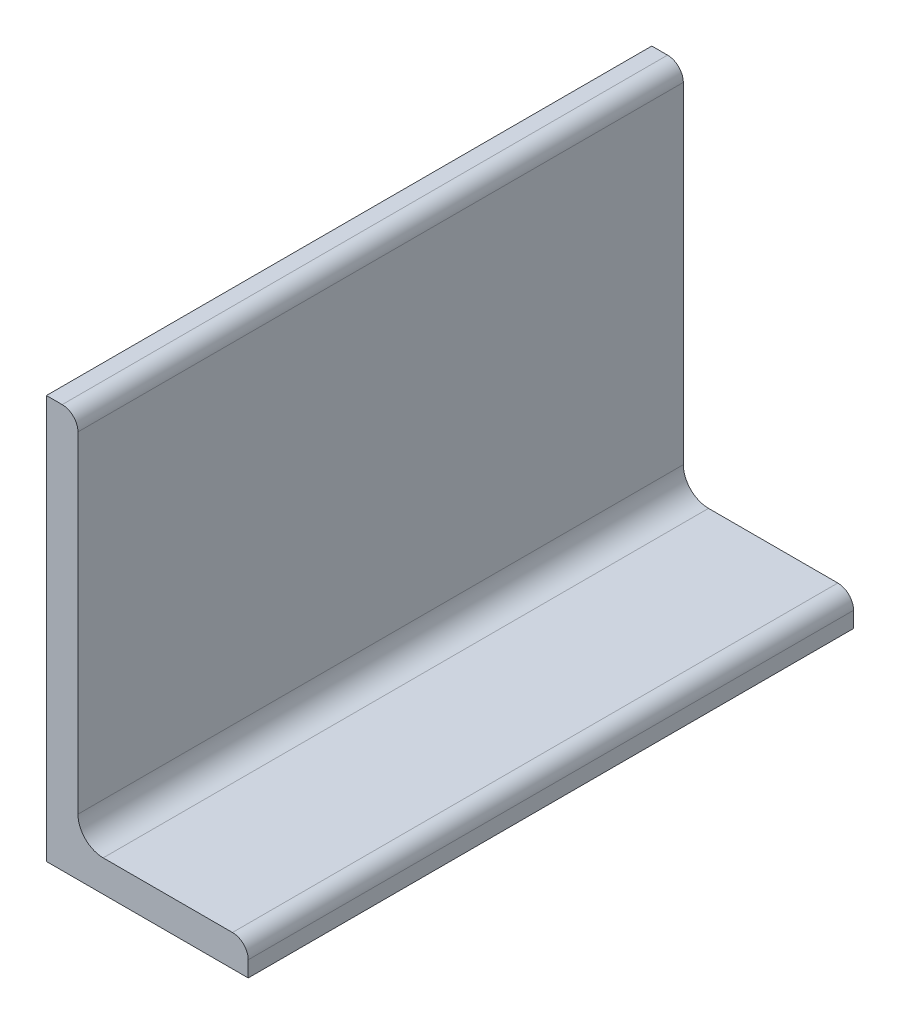
ISO-10303-21;
HEADER;
FILE_DESCRIPTION(('STEP AP214'),'2;1');
FILE_NAME('part.step','',(''),(''),'','','');
FILE_SCHEMA(('AUTOMOTIVE_DESIGN { 1 0 10303 214 1 1 1 1 }'));
ENDSEC;
DATA;
#1=APPLICATION_CONTEXT('core data for automotive mechanical design processes');
#2=APPLICATION_PROTOCOL_DEFINITION('international standard','automotive_design',2000,#1);
#3=PRODUCT_CONTEXT('',#1,'mechanical');
#4=PRODUCT('Part','Part','',(#3));
#5=PRODUCT_RELATED_PRODUCT_CATEGORY('part','',(#4));
#6=PRODUCT_DEFINITION_FORMATION('','',#4);
#7=PRODUCT_DEFINITION_CONTEXT('part definition',#1,'design');
#8=PRODUCT_DEFINITION('design','',#6,#7);
#9=PRODUCT_DEFINITION_SHAPE('','',#8);
#10=(LENGTH_UNIT() NAMED_UNIT(*) SI_UNIT(.MILLI.,.METRE.));
#11=(NAMED_UNIT(*) PLANE_ANGLE_UNIT() SI_UNIT($,.RADIAN.));
#12=(NAMED_UNIT(*) SI_UNIT($,.STERADIAN.) SOLID_ANGLE_UNIT());
#13=UNCERTAINTY_MEASURE_WITH_UNIT(LENGTH_MEASURE(1.E-05),#10,'distance_accuracy_value','');
#14=(GEOMETRIC_REPRESENTATION_CONTEXT(3) GLOBAL_UNCERTAINTY_ASSIGNED_CONTEXT((#13)) GLOBAL_UNIT_ASSIGNED_CONTEXT((#10,
#11,#12)) REPRESENTATION_CONTEXT('',''));
#15=CARTESIAN_POINT('',(0.,0.,0.));
#16=DIRECTION('',(0.,0.,1.));
#17=DIRECTION('',(1.,0.,0.));
#18=AXIS2_PLACEMENT_3D('',#15,#16,#17);
#19=CARTESIAN_POINT('',(0.865045893659089,203.678837479772,304.8));
#20=DIRECTION('',(1.,0.,0.));
#21=DIRECTION('',(0.,0.,-1.));
#22=AXIS2_PLACEMENT_3D('',#19,#20,#21);
#23=PLANE('',#22);
#24=DIRECTION('',(0.,-1.,0.));
#25=VECTOR('',#24,1.);
#26=CARTESIAN_POINT('',(0.865045893659089,203.678837479772,0.));
#27=LINE('',#26,#25);
#28=CARTESIAN_POINT('',(0.865045893659089,203.678837479772,0.));
#29=VERTEX_POINT('',#28);
#30=CARTESIAN_POINT('',(0.865045893659089,0.478837479771708,0.));
#31=VERTEX_POINT('',#30);
#32=EDGE_CURVE('E135',#29,#31,#27,.T.);
#33=ORIENTED_EDGE('',*,*,#32,.T.);
#34=DIRECTION('',(0.,0.,-1.));
#35=VECTOR('',#34,1.);
#36=CARTESIAN_POINT('',(0.865045893659089,0.478837479771708,304.8));
#37=LINE('',#36,#35);
#38=CARTESIAN_POINT('',(0.865045893659089,0.478837479771708,304.8));
#39=VERTEX_POINT('',#38);
#40=EDGE_CURVE('E11',#39,#31,#37,.T.);
#41=ORIENTED_EDGE('',*,*,#40,.F.);
#42=DIRECTION('',(0.,-1.,0.));
#43=VECTOR('',#42,1.);
#44=CARTESIAN_POINT('',(0.865045893659089,203.678837479772,304.8));
#45=LINE('',#44,#43);
#46=CARTESIAN_POINT('',(0.865045893659089,203.678837479772,304.8));
#47=VERTEX_POINT('',#46);
#48=EDGE_CURVE('E151',#47,#39,#45,.T.);
#49=ORIENTED_EDGE('',*,*,#48,.F.);
#50=DIRECTION('',(0.,0.,-1.));
#51=VECTOR('',#50,1.);
#52=CARTESIAN_POINT('',(0.865045893659089,203.678837479772,304.8));
#53=LINE('',#52,#51);
#54=EDGE_CURVE('E131',#47,#29,#53,.T.);
#55=ORIENTED_EDGE('',*,*,#54,.T.);
#56=EDGE_LOOP('',(#33,#41,#49,#55));
#57=FACE_BOUND('',#56,.T.);
#58=ADVANCED_FACE('F33',(#57),#23,.F.);
#59=CARTESIAN_POINT('',(0.865045893659089,0.478837479771708,304.8));
#60=DIRECTION('',(0.,1.,0.));
#61=DIRECTION('',(0.,0.,1.));
#62=AXIS2_PLACEMENT_3D('',#59,#60,#61);
#63=PLANE('',#62);
#64=DIRECTION('',(1.,0.,0.));
#65=VECTOR('',#64,1.);
#66=CARTESIAN_POINT('',(0.865045893659089,0.478837479771708,0.));
#67=LINE('',#66,#65);
#68=CARTESIAN_POINT('',(102.465045893659,0.478837479771708,0.));
#69=VERTEX_POINT('',#68);
#70=EDGE_CURVE('E138',#31,#69,#67,.T.);
#71=ORIENTED_EDGE('',*,*,#70,.T.);
#72=DIRECTION('',(0.,0.,-1.));
#73=VECTOR('',#72,1.);
#74=CARTESIAN_POINT('',(102.465045893659,0.478837479771708,304.8));
#75=LINE('',#74,#73);
#76=CARTESIAN_POINT('',(102.465045893659,0.478837479771708,304.8));
#77=VERTEX_POINT('',#76);
#78=EDGE_CURVE('E41',#77,#69,#75,.T.);
#79=ORIENTED_EDGE('',*,*,#78,.F.);
#80=DIRECTION('',(1.,0.,0.));
#81=VECTOR('',#80,1.);
#82=CARTESIAN_POINT('',(0.865045893659089,0.478837479771708,304.8));
#83=LINE('',#82,#81);
#84=EDGE_CURVE('E95',#39,#77,#83,.T.);
#85=ORIENTED_EDGE('',*,*,#84,.F.);
#86=ORIENTED_EDGE('',*,*,#40,.T.);
#87=EDGE_LOOP('',(#71,#79,#85,#86));
#88=FACE_BOUND('',#87,.T.);
#89=ADVANCED_FACE('F194',(#88),#63,.F.);
#90=CARTESIAN_POINT('',(102.465045893659,0.478837479771708,304.8));
#91=DIRECTION('',(-1.,0.,0.));
#92=DIRECTION('',(0.,0.,1.));
#93=AXIS2_PLACEMENT_3D('',#90,#91,#92);
#94=PLANE('',#93);
#95=DIRECTION('',(0.,1.,0.));
#96=VECTOR('',#95,1.);
#97=CARTESIAN_POINT('',(102.465045893659,0.478837479771708,0.));
#98=LINE('',#97,#96);
#99=CARTESIAN_POINT('',(102.465045893659,8.41633747977171,0.));
#100=VERTEX_POINT('',#99);
#101=EDGE_CURVE('E140',#69,#100,#98,.T.);
#102=ORIENTED_EDGE('',*,*,#101,.T.);
#103=DIRECTION('',(0.,0.,-1.));
#104=VECTOR('',#103,1.);
#105=CARTESIAN_POINT('',(102.465045893659,8.41633747977171,304.8));
#106=LINE('',#105,#104);
#107=CARTESIAN_POINT('',(102.465045893659,8.41633747977171,304.8));
#108=VERTEX_POINT('',#107);
#109=EDGE_CURVE('E161',#108,#100,#106,.T.);
#110=ORIENTED_EDGE('',*,*,#109,.F.);
#111=DIRECTION('',(0.,1.,0.));
#112=VECTOR('',#111,1.);
#113=CARTESIAN_POINT('',(102.465045893659,0.478837479771708,304.8));
#114=LINE('',#113,#112);
#115=EDGE_CURVE('E169',#77,#108,#114,.T.);
#116=ORIENTED_EDGE('',*,*,#115,.F.);
#117=ORIENTED_EDGE('',*,*,#78,.T.);
#118=EDGE_LOOP('',(#102,#110,#116,#117));
#119=FACE_BOUND('',#118,.T.);
#120=ADVANCED_FACE('F167',(#119),#94,.F.);
#121=CARTESIAN_POINT('',(94.5275458936591,8.4163374797717,304.8));
#122=DIRECTION('',(0.,0.,-1.));
#123=DIRECTION('',(-1.,0.,0.));
#124=AXIS2_PLACEMENT_3D('',#121,#122,#123);
#125=CYLINDRICAL_SURFACE('',#124,7.93750000000001);
#126=CARTESIAN_POINT('',(94.5275458936591,8.4163374797717,0.));
#127=DIRECTION('',(0.,0.,1.));
#128=DIRECTION('',(1.,0.,0.));
#129=AXIS2_PLACEMENT_3D('',#126,#127,#128);
#130=CIRCLE('',#129,7.93750000000001);
#131=CARTESIAN_POINT('',(94.5275458936591,16.3538374797717,0.));
#132=VERTEX_POINT('',#131);
#133=EDGE_CURVE('E142',#100,#132,#130,.T.);
#134=ORIENTED_EDGE('',*,*,#133,.T.);
#135=DIRECTION('',(0.,0.,-1.));
#136=VECTOR('',#135,1.);
#137=CARTESIAN_POINT('',(94.5275458936591,16.3538374797717,304.8));
#138=LINE('',#137,#136);
#139=CARTESIAN_POINT('',(94.5275458936591,16.3538374797717,304.8));
#140=VERTEX_POINT('',#139);
#141=EDGE_CURVE('E158',#140,#132,#138,.T.);
#142=ORIENTED_EDGE('',*,*,#141,.F.);
#143=CARTESIAN_POINT('',(94.5275458936591,8.4163374797717,304.8));
#144=DIRECTION('',(0.,0.,1.));
#145=DIRECTION('',(1.,0.,0.));
#146=AXIS2_PLACEMENT_3D('',#143,#144,#145);
#147=CIRCLE('',#146,7.93750000000001);
#148=EDGE_CURVE('E185',#108,#140,#147,.T.);
#149=ORIENTED_EDGE('',*,*,#148,.F.);
#150=ORIENTED_EDGE('',*,*,#109,.T.);
#151=EDGE_LOOP('',(#134,#142,#149,#150));
#152=FACE_BOUND('',#151,.T.);
#153=ADVANCED_FACE('F178',(#152),#125,.T.);
#154=CARTESIAN_POINT('',(94.5275458936591,16.3538374797717,304.8));
#155=DIRECTION('',(0.,-1.,0.));
#156=DIRECTION('',(0.,0.,-1.));
#157=AXIS2_PLACEMENT_3D('',#154,#155,#156);
#158=PLANE('',#157);
#159=DIRECTION('',(-1.,0.,0.));
#160=VECTOR('',#159,1.);
#161=CARTESIAN_POINT('',(94.5275458936591,16.3538374797717,0.));
#162=LINE('',#161,#160);
#163=CARTESIAN_POINT('',(29.4400458936591,16.3538374797717,0.));
#164=VERTEX_POINT('',#163);
#165=EDGE_CURVE('E144',#132,#164,#162,.T.);
#166=ORIENTED_EDGE('',*,*,#165,.T.);
#167=DIRECTION('',(0.,0.,-1.));
#168=VECTOR('',#167,1.);
#169=CARTESIAN_POINT('',(29.4400458936591,16.3538374797717,304.8));
#170=LINE('',#169,#168);
#171=CARTESIAN_POINT('',(29.4400458936591,16.3538374797717,304.8));
#172=VERTEX_POINT('',#171);
#173=EDGE_CURVE('E155',#172,#164,#170,.T.);
#174=ORIENTED_EDGE('',*,*,#173,.F.);
#175=DIRECTION('',(-1.,0.,0.));
#176=VECTOR('',#175,1.);
#177=CARTESIAN_POINT('',(94.5275458936591,16.3538374797717,304.8));
#178=LINE('',#177,#176);
#179=EDGE_CURVE('E184',#140,#172,#178,.T.);
#180=ORIENTED_EDGE('',*,*,#179,.F.);
#181=ORIENTED_EDGE('',*,*,#141,.T.);
#182=EDGE_LOOP('',(#166,#174,#180,#181));
#183=FACE_BOUND('',#182,.T.);
#184=ADVANCED_FACE('F182',(#183),#158,.F.);
#185=CARTESIAN_POINT('',(29.4400458936591,29.0538374797717,304.8));
#186=DIRECTION('',(0.,0.,-1.));
#187=DIRECTION('',(-1.,0.,0.));
#188=AXIS2_PLACEMENT_3D('',#185,#186,#187);
#189=CYLINDRICAL_SURFACE('',#188,12.7);
#190=CARTESIAN_POINT('',(29.4400458936591,29.0538374797717,0.));
#191=DIRECTION('',(0.,0.,-1.));
#192=DIRECTION('',(1.,0.,0.));
#193=AXIS2_PLACEMENT_3D('',#190,#191,#192);
#194=CIRCLE('',#193,12.7);
#195=CARTESIAN_POINT('',(16.7400458936591,29.0538374797717,0.));
#196=VERTEX_POINT('',#195);
#197=EDGE_CURVE('E146',#164,#196,#194,.T.);
#198=ORIENTED_EDGE('',*,*,#197,.T.);
#199=DIRECTION('',(0.,0.,-1.));
#200=VECTOR('',#199,1.);
#201=CARTESIAN_POINT('',(16.7400458936591,29.0538374797717,304.8));
#202=LINE('',#201,#200);
#203=CARTESIAN_POINT('',(16.7400458936591,29.0538374797717,304.8));
#204=VERTEX_POINT('',#203);
#205=EDGE_CURVE('E126',#204,#196,#202,.T.);
#206=ORIENTED_EDGE('',*,*,#205,.F.);
#207=CARTESIAN_POINT('',(29.4400458936591,29.0538374797717,304.8));
#208=DIRECTION('',(0.,0.,-1.));
#209=DIRECTION('',(1.,0.,0.));
#210=AXIS2_PLACEMENT_3D('',#207,#208,#209);
#211=CIRCLE('',#210,12.7);
#212=EDGE_CURVE('E117',#172,#204,#211,.T.);
#213=ORIENTED_EDGE('',*,*,#212,.F.);
#214=ORIENTED_EDGE('',*,*,#173,.T.);
#215=EDGE_LOOP('',(#198,#206,#213,#214));
#216=FACE_BOUND('',#215,.T.);
#217=ADVANCED_FACE('F206',(#216),#189,.F.);
#218=CARTESIAN_POINT('',(16.7400458936591,29.0538374797717,304.8));
#219=DIRECTION('',(-1.,0.,0.));
#220=DIRECTION('',(0.,0.,1.));
#221=AXIS2_PLACEMENT_3D('',#218,#219,#220);
#222=PLANE('',#221);
#223=DIRECTION('',(0.,1.,0.));
#224=VECTOR('',#223,1.);
#225=CARTESIAN_POINT('',(16.7400458936591,29.0538374797717,0.));
#226=LINE('',#225,#224);
#227=CARTESIAN_POINT('',(16.7400458936591,195.741337479772,0.));
#228=VERTEX_POINT('',#227);
#229=EDGE_CURVE('E125',#196,#228,#226,.T.);
#230=ORIENTED_EDGE('',*,*,#229,.T.);
#231=DIRECTION('',(0.,0.,-1.));
#232=VECTOR('',#231,1.);
#233=CARTESIAN_POINT('',(16.7400458936591,195.741337479772,304.8));
#234=LINE('',#233,#232);
#235=CARTESIAN_POINT('',(16.7400458936591,195.741337479772,304.8));
#236=VERTEX_POINT('',#235);
#237=EDGE_CURVE('E122',#236,#228,#234,.T.);
#238=ORIENTED_EDGE('',*,*,#237,.F.);
#239=DIRECTION('',(0.,1.,0.));
#240=VECTOR('',#239,1.);
#241=CARTESIAN_POINT('',(16.7400458936591,29.0538374797717,304.8));
#242=LINE('',#241,#240);
#243=EDGE_CURVE('E111',#204,#236,#242,.T.);
#244=ORIENTED_EDGE('',*,*,#243,.F.);
#245=ORIENTED_EDGE('',*,*,#205,.T.);
#246=EDGE_LOOP('',(#230,#238,#244,#245));
#247=FACE_BOUND('',#246,.T.);
#248=ADVANCED_FACE('F123',(#247),#222,.F.);
#249=CARTESIAN_POINT('',(8.80254589365908,195.741337479772,304.8));
#250=DIRECTION('',(0.,0.,-1.));
#251=DIRECTION('',(-1.,0.,0.));
#252=AXIS2_PLACEMENT_3D('',#249,#250,#251);
#253=CYLINDRICAL_SURFACE('',#252,7.93749999999999);
#254=CARTESIAN_POINT('',(8.80254589365908,195.741337479772,0.));
#255=DIRECTION('',(0.,0.,1.));
#256=DIRECTION('',(1.,0.,0.));
#257=AXIS2_PLACEMENT_3D('',#254,#255,#256);
#258=CIRCLE('',#257,7.93749999999999);
#259=CARTESIAN_POINT('',(8.80254589365909,203.678837479772,0.));
#260=VERTEX_POINT('',#259);
#261=EDGE_CURVE('E81',#228,#260,#258,.T.);
#262=ORIENTED_EDGE('',*,*,#261,.T.);
#263=DIRECTION('',(0.,0.,-1.));
#264=VECTOR('',#263,1.);
#265=CARTESIAN_POINT('',(8.80254589365909,203.678837479772,304.8));
#266=LINE('',#265,#264);
#267=CARTESIAN_POINT('',(8.80254589365909,203.678837479772,304.8));
#268=VERTEX_POINT('',#267);
#269=EDGE_CURVE('E127',#268,#260,#266,.T.);
#270=ORIENTED_EDGE('',*,*,#269,.F.);
#271=CARTESIAN_POINT('',(8.80254589365908,195.741337479772,304.8));
#272=DIRECTION('',(0.,0.,1.));
#273=DIRECTION('',(1.,0.,0.));
#274=AXIS2_PLACEMENT_3D('',#271,#272,#273);
#275=CIRCLE('',#274,7.93749999999999);
#276=EDGE_CURVE('E115',#236,#268,#275,.T.);
#277=ORIENTED_EDGE('',*,*,#276,.F.);
#278=ORIENTED_EDGE('',*,*,#237,.T.);
#279=EDGE_LOOP('',(#262,#270,#277,#278));
#280=FACE_BOUND('',#279,.T.);
#281=ADVANCED_FACE('F129',(#280),#253,.T.);
#282=CARTESIAN_POINT('',(8.80254589365909,203.678837479772,304.8));
#283=DIRECTION('',(0.,-1.,0.));
#284=DIRECTION('',(0.,0.,-1.));
#285=AXIS2_PLACEMENT_3D('',#282,#283,#284);
#286=PLANE('',#285);
#287=DIRECTION('',(-1.,0.,0.));
#288=VECTOR('',#287,1.);
#289=CARTESIAN_POINT('',(8.80254589365909,203.678837479772,0.));
#290=LINE('',#289,#288);
#291=EDGE_CURVE('E87',#260,#29,#290,.T.);
#292=ORIENTED_EDGE('',*,*,#291,.T.);
#293=ORIENTED_EDGE('',*,*,#54,.F.);
#294=DIRECTION('',(-1.,0.,0.));
#295=VECTOR('',#294,1.);
#296=CARTESIAN_POINT('',(8.80254589365909,203.678837479772,304.8));
#297=LINE('',#296,#295);
#298=EDGE_CURVE('E49',#268,#47,#297,.T.);
#299=ORIENTED_EDGE('',*,*,#298,.F.);
#300=ORIENTED_EDGE('',*,*,#269,.T.);
#301=EDGE_LOOP('',(#292,#293,#299,#300));
#302=FACE_BOUND('',#301,.T.);
#303=ADVANCED_FACE('F214',(#302),#286,.F.);
#304=CARTESIAN_POINT('',(94.5275458936591,8.4163374797717,304.8));
#305=DIRECTION('',(0.,0.,1.));
#306=DIRECTION('',(1.,0.,0.));
#307=AXIS2_PLACEMENT_3D('',#304,#305,#306);
#308=PLANE('',#307);
#309=ORIENTED_EDGE('',*,*,#48,.T.);
#310=ORIENTED_EDGE('',*,*,#84,.T.);
#311=ORIENTED_EDGE('',*,*,#115,.T.);
#312=ORIENTED_EDGE('',*,*,#148,.T.);
#313=ORIENTED_EDGE('',*,*,#179,.T.);
#314=ORIENTED_EDGE('',*,*,#212,.T.);
#315=ORIENTED_EDGE('',*,*,#243,.T.);
#316=ORIENTED_EDGE('',*,*,#276,.T.);
#317=ORIENTED_EDGE('',*,*,#298,.T.);
#318=EDGE_LOOP('',(#309,#310,#311,#312,#313,#314,#315,#316,#317));
#319=FACE_BOUND('',#318,.T.);
#320=ADVANCED_FACE('F113',(#319),#308,.T.);
#321=CARTESIAN_POINT('',(94.5275458936591,8.4163374797717,0.));
#322=DIRECTION('',(0.,0.,1.));
#323=DIRECTION('',(1.,0.,0.));
#324=AXIS2_PLACEMENT_3D('',#321,#322,#323);
#325=PLANE('',#324);
#326=ORIENTED_EDGE('',*,*,#32,.F.);
#327=ORIENTED_EDGE('',*,*,#291,.F.);
#328=ORIENTED_EDGE('',*,*,#261,.F.);
#329=ORIENTED_EDGE('',*,*,#229,.F.);
#330=ORIENTED_EDGE('',*,*,#197,.F.);
#331=ORIENTED_EDGE('',*,*,#165,.F.);
#332=ORIENTED_EDGE('',*,*,#133,.F.);
#333=ORIENTED_EDGE('',*,*,#101,.F.);
#334=ORIENTED_EDGE('',*,*,#70,.F.);
#335=EDGE_LOOP('',(#326,#327,#328,#329,#330,#331,#332,#333,#334));
#336=FACE_BOUND('',#335,.T.);
#337=ADVANCED_FACE('F173',(#336),#325,.F.);
#338=CLOSED_SHELL('',(#58,#89,#120,#153,#184,#217,#248,#281,#303,#320,#337));
#339=MANIFOLD_SOLID_BREP('B2',#338);
#340=ADVANCED_BREP_SHAPE_REPRESENTATION('',(#18,#339),#14);
#341=SHAPE_DEFINITION_REPRESENTATION(#9,#340);
ENDSEC;
END-ISO-10303-21;
